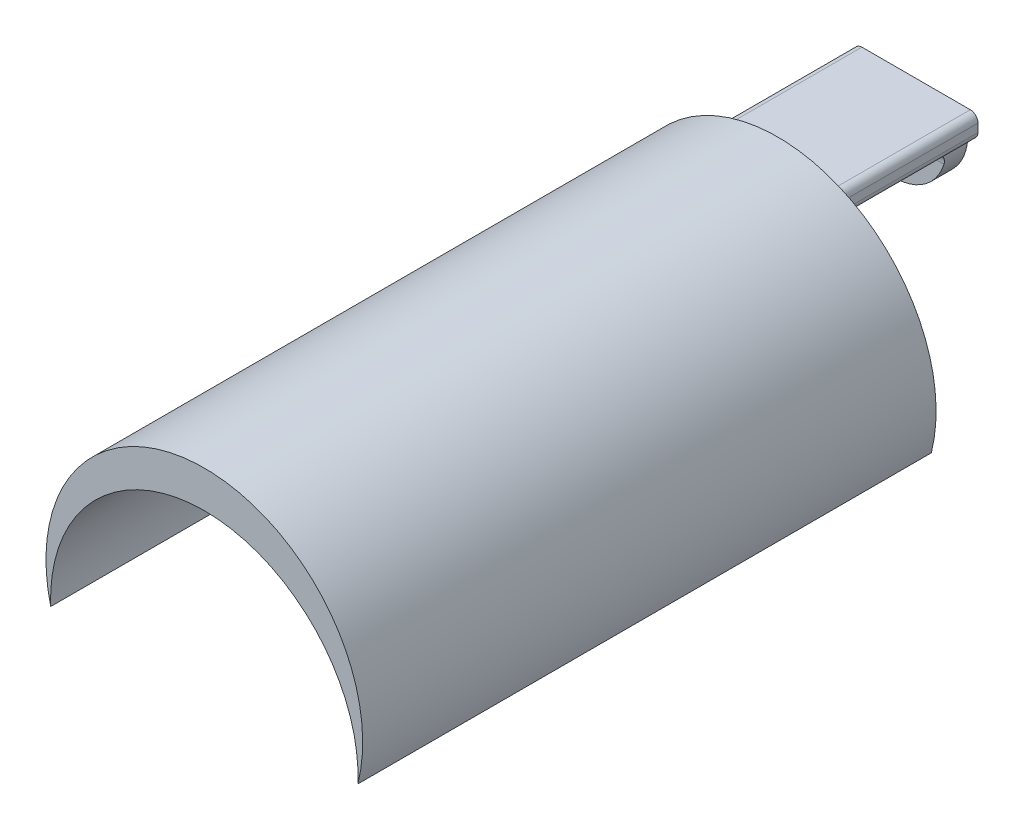
ISO-10303-21;
HEADER;
FILE_DESCRIPTION(('STEP AP214'),'2;1');
FILE_NAME('part.step','',(''),(''),'','','');
FILE_SCHEMA(('AUTOMOTIVE_DESIGN { 1 0 10303 214 1 1 1 1 }'));
ENDSEC;
DATA;
#1=APPLICATION_CONTEXT('core data for automotive mechanical design processes');
#2=APPLICATION_PROTOCOL_DEFINITION('international standard','automotive_design',2000,#1);
#3=PRODUCT_CONTEXT('',#1,'mechanical');
#4=PRODUCT('Part','Part','',(#3));
#5=PRODUCT_RELATED_PRODUCT_CATEGORY('part','',(#4));
#6=PRODUCT_DEFINITION_FORMATION('','',#4);
#7=PRODUCT_DEFINITION_CONTEXT('part definition',#1,'design');
#8=PRODUCT_DEFINITION('design','',#6,#7);
#9=PRODUCT_DEFINITION_SHAPE('','',#8);
#10=(LENGTH_UNIT() NAMED_UNIT(*) SI_UNIT(.MILLI.,.METRE.));
#11=(NAMED_UNIT(*) PLANE_ANGLE_UNIT() SI_UNIT($,.RADIAN.));
#12=(NAMED_UNIT(*) SI_UNIT($,.STERADIAN.) SOLID_ANGLE_UNIT());
#13=UNCERTAINTY_MEASURE_WITH_UNIT(LENGTH_MEASURE(1.E-05),#10,'distance_accuracy_value','');
#14=(GEOMETRIC_REPRESENTATION_CONTEXT(3) GLOBAL_UNCERTAINTY_ASSIGNED_CONTEXT((#13)) GLOBAL_UNIT_ASSIGNED_CONTEXT((#10,
#11,#12)) REPRESENTATION_CONTEXT('',''));
#15=CARTESIAN_POINT('',(0.,0.,0.));
#16=DIRECTION('',(0.,0.,1.));
#17=DIRECTION('',(1.,0.,0.));
#18=AXIS2_PLACEMENT_3D('',#15,#16,#17);
#19=CARTESIAN_POINT('',(0.,0.,0.));
#20=DIRECTION('',(0.,0.,1.));
#21=DIRECTION('',(1.,0.,0.));
#22=AXIS2_PLACEMENT_3D('',#19,#20,#21);
#23=PLANE('',#22);
#24=CARTESIAN_POINT('',(0.,0.,0.));
#25=DIRECTION('',(0.,0.,1.));
#26=DIRECTION('',(1.,0.,0.));
#27=AXIS2_PLACEMENT_3D('',#24,#25,#26);
#28=CIRCLE('',#27,26.162);
#29=CARTESIAN_POINT('',(25.3796718654911,-6.34999999999999,0.));
#30=VERTEX_POINT('',#29);
#31=CARTESIAN_POINT('',(-25.3796718654911,-6.34999999999999,0.));
#32=VERTEX_POINT('',#31);
#33=EDGE_CURVE('E219',#30,#32,#28,.T.);
#34=ORIENTED_EDGE('',*,*,#33,.F.);
#35=DIRECTION('',(-1.,0.,0.));
#36=VECTOR('',#35,1.);
#37=CARTESIAN_POINT('',(0.,-6.34999999999999,0.));
#38=LINE('',#37,#36);
#39=CARTESIAN_POINT('',(19.8388283648417,-6.34999999999999,0.));
#40=VERTEX_POINT('',#39);
#41=EDGE_CURVE('E194',#30,#40,#38,.T.);
#42=ORIENTED_EDGE('',*,*,#41,.T.);
#43=CARTESIAN_POINT('',(0.,-3.33914545181102,0.));
#44=DIRECTION('',(0.,0.,1.));
#45=DIRECTION('',(1.,0.,0.));
#46=AXIS2_PLACEMENT_3D('',#43,#44,#45);
#47=CIRCLE('',#46,20.066);
#48=CARTESIAN_POINT('',(-19.8388283648418,-6.35,0.));
#49=VERTEX_POINT('',#48);
#50=EDGE_CURVE('E207',#40,#49,#47,.T.);
#51=ORIENTED_EDGE('',*,*,#50,.T.);
#52=EDGE_CURVE('E198',#49,#32,#38,.T.);
#53=ORIENTED_EDGE('',*,*,#52,.T.);
#54=EDGE_LOOP('',(#34,#42,#51,#53));
#55=FACE_BOUND('',#54,.T.);
#56=CARTESIAN_POINT('',(-8.95790759547679,21.8350726392476,0.));
#57=DIRECTION('',(0.,0.,-1.));
#58=DIRECTION('',(-1.,0.,0.));
#59=AXIS2_PLACEMENT_3D('',#56,#57,#58);
#60=CIRCLE('',#59,1.27);
#61=CARTESIAN_POINT('',(-10.2279075954768,21.8350726392475,0.));
#62=VERTEX_POINT('',#61);
#63=CARTESIAN_POINT('',(-8.95790759547678,23.1050726392476,0.));
#64=VERTEX_POINT('',#63);
#65=EDGE_CURVE('E184',#62,#64,#60,.T.);
#66=ORIENTED_EDGE('',*,*,#65,.F.);
#67=DIRECTION('',(0.,1.,0.));
#68=VECTOR('',#67,1.);
#69=CARTESIAN_POINT('',(-10.2279075954768,21.8350726392475,0.));
#70=LINE('',#69,#68);
#71=CARTESIAN_POINT('',(-10.2279075954768,20.4735079918104,0.));
#72=VERTEX_POINT('',#71);
#73=EDGE_CURVE('E181',#72,#62,#70,.T.);
#74=ORIENTED_EDGE('',*,*,#73,.F.);
#75=CARTESIAN_POINT('',(-8.95790759547679,20.4735079918104,0.));
#76=DIRECTION('',(0.,0.,-1.));
#77=DIRECTION('',(1.,0.,0.));
#78=AXIS2_PLACEMENT_3D('',#75,#76,#77);
#79=CIRCLE('',#78,1.27);
#80=CARTESIAN_POINT('',(-8.95790759547678,19.2035079918104,0.));
#81=VERTEX_POINT('',#80);
#82=EDGE_CURVE('E335',#81,#72,#79,.T.);
#83=ORIENTED_EDGE('',*,*,#82,.F.);
#84=DIRECTION('',(-1.,0.,0.));
#85=VECTOR('',#84,1.);
#86=CARTESIAN_POINT('',(8.95790759547678,19.2035079918104,0.));
#87=LINE('',#86,#85);
#88=CARTESIAN_POINT('',(8.95790759547678,19.2035079918104,0.));
#89=VERTEX_POINT('',#88);
#90=EDGE_CURVE('E367',#89,#81,#87,.T.);
#91=ORIENTED_EDGE('',*,*,#90,.F.);
#92=CARTESIAN_POINT('',(8.95790759547679,20.4735079918104,0.));
#93=DIRECTION('',(0.,0.,-1.));
#94=DIRECTION('',(-1.,0.,0.));
#95=AXIS2_PLACEMENT_3D('',#92,#93,#94);
#96=CIRCLE('',#95,1.27);
#97=CARTESIAN_POINT('',(10.2279075954768,20.4735079918104,0.));
#98=VERTEX_POINT('',#97);
#99=EDGE_CURVE('E361',#98,#89,#96,.T.);
#100=ORIENTED_EDGE('',*,*,#99,.F.);
#101=DIRECTION('',(0.,-1.,0.));
#102=VECTOR('',#101,1.);
#103=CARTESIAN_POINT('',(10.2279075954768,21.8350726392475,0.));
#104=LINE('',#103,#102);
#105=CARTESIAN_POINT('',(10.2279075954768,21.8350726392475,0.));
#106=VERTEX_POINT('',#105);
#107=EDGE_CURVE('E356',#106,#98,#104,.T.);
#108=ORIENTED_EDGE('',*,*,#107,.F.);
#109=CARTESIAN_POINT('',(8.95790759547679,21.8350726392476,0.));
#110=DIRECTION('',(0.,0.,-1.));
#111=DIRECTION('',(1.,0.,0.));
#112=AXIS2_PLACEMENT_3D('',#109,#110,#111);
#113=CIRCLE('',#112,1.27);
#114=CARTESIAN_POINT('',(8.95790759547678,23.1050726392476,0.));
#115=VERTEX_POINT('',#114);
#116=EDGE_CURVE('E359',#115,#106,#113,.T.);
#117=ORIENTED_EDGE('',*,*,#116,.F.);
#118=DIRECTION('',(1.,0.,0.));
#119=VECTOR('',#118,1.);
#120=CARTESIAN_POINT('',(8.95790759547678,23.1050726392476,0.));
#121=LINE('',#120,#119);
#122=EDGE_CURVE('E328',#64,#115,#121,.T.);
#123=ORIENTED_EDGE('',*,*,#122,.F.);
#124=EDGE_LOOP('',(#66,#74,#83,#91,#100,#108,#117,#123));
#125=FACE_BOUND('',#124,.T.);
#126=ADVANCED_FACE('F33',(#55,#125),#23,.F.);
#127=CARTESIAN_POINT('',(0.,0.,94.742));
#128=DIRECTION('',(0.,0.,-1.));
#129=DIRECTION('',(-1.,0.,0.));
#130=AXIS2_PLACEMENT_3D('',#127,#128,#129);
#131=CYLINDRICAL_SURFACE('',#130,26.162);
#132=DIRECTION('',(0.,0.,1.));
#133=VECTOR('',#132,1.);
#134=CARTESIAN_POINT('',(25.3796718654911,-6.34999999999999,77.216));
#135=LINE('',#134,#133);
#136=CARTESIAN_POINT('',(25.3796718654911,-6.34999999999999,94.742));
#137=VERTEX_POINT('',#136);
#138=CARTESIAN_POINT('',(25.3796718654911,-6.34999999999999,59.69));
#139=VERTEX_POINT('',#138);
#140=EDGE_CURVE('E213',#137,#139,#135,.F.);
#141=ORIENTED_EDGE('',*,*,#140,.T.);
#142=DIRECTION('',(0.,0.,-1.));
#143=VECTOR('',#142,1.);
#144=CARTESIAN_POINT('',(25.3796718654911,-6.34999999999999,94.742));
#145=LINE('',#144,#143);
#146=EDGE_CURVE('E197',#139,#30,#145,.T.);
#147=ORIENTED_EDGE('',*,*,#146,.T.);
#148=ORIENTED_EDGE('',*,*,#33,.T.);
#149=DIRECTION('',(0.,0.,-1.));
#150=VECTOR('',#149,1.);
#151=CARTESIAN_POINT('',(-25.3796718654911,-6.34999999999999,94.742));
#152=LINE('',#151,#150);
#153=CARTESIAN_POINT('',(-25.3796718654911,-6.34999999999999,59.69));
#154=VERTEX_POINT('',#153);
#155=EDGE_CURVE('E201',#32,#154,#152,.F.);
#156=ORIENTED_EDGE('',*,*,#155,.T.);
#157=DIRECTION('',(0.,0.,1.));
#158=VECTOR('',#157,1.);
#159=CARTESIAN_POINT('',(-25.3796718654911,-6.34999999999999,77.216));
#160=LINE('',#159,#158);
#161=CARTESIAN_POINT('',(-25.3796718654911,-6.34999999999999,94.742));
#162=VERTEX_POINT('',#161);
#163=EDGE_CURVE('E216',#154,#162,#160,.T.);
#164=ORIENTED_EDGE('',*,*,#163,.T.);
#165=CARTESIAN_POINT('',(0.,0.,94.742));
#166=DIRECTION('',(0.,0.,1.));
#167=DIRECTION('',(1.,0.,0.));
#168=AXIS2_PLACEMENT_3D('',#165,#166,#167);
#169=CIRCLE('',#168,26.162);
#170=EDGE_CURVE('E220',#137,#162,#169,.T.);
#171=ORIENTED_EDGE('',*,*,#170,.F.);
#172=EDGE_LOOP('',(#141,#147,#148,#156,#164,#171));
#173=FACE_BOUND('',#172,.T.);
#174=ADVANCED_FACE('F307',(#173),#131,.T.);
#175=CARTESIAN_POINT('',(0.,0.,94.742));
#176=DIRECTION('',(0.,0.,1.));
#177=DIRECTION('',(1.,0.,0.));
#178=AXIS2_PLACEMENT_3D('',#175,#176,#177);
#179=PLANE('',#178);
#180=CARTESIAN_POINT('',(0.,-5.334,94.742));
#181=DIRECTION('',(0.,0.,1.));
#182=DIRECTION('',(1.,0.,0.));
#183=AXIS2_PLACEMENT_3D('',#180,#181,#182);
#184=CIRCLE('',#183,25.4);
#185=EDGE_CURVE('E223',#137,#162,#184,.T.);
#186=ORIENTED_EDGE('',*,*,#185,.F.);
#187=ORIENTED_EDGE('',*,*,#170,.T.);
#188=EDGE_LOOP('',(#186,#187));
#189=FACE_BOUND('',#188,.T.);
#190=ADVANCED_FACE('F300',(#189),#179,.T.);
#191=CARTESIAN_POINT('',(0.,-5.334,59.69));
#192=DIRECTION('',(0.,0.,1.));
#193=DIRECTION('',(1.,0.,0.));
#194=AXIS2_PLACEMENT_3D('',#191,#192,#193);
#195=PLANE('',#194);
#196=DIRECTION('',(1.,0.,0.));
#197=VECTOR('',#196,1.);
#198=CARTESIAN_POINT('',(-33.909,-6.34999999999999,59.69));
#199=LINE('',#198,#197);
#200=CARTESIAN_POINT('',(19.8388283648418,-6.35,59.69));
#201=VERTEX_POINT('',#200);
#202=EDGE_CURVE('E185',#201,#139,#199,.T.);
#203=ORIENTED_EDGE('',*,*,#202,.T.);
#204=CARTESIAN_POINT('',(0.,-5.334,59.69));
#205=DIRECTION('',(0.,0.,1.));
#206=DIRECTION('',(1.,0.,0.));
#207=AXIS2_PLACEMENT_3D('',#204,#205,#206);
#208=CIRCLE('',#207,25.4);
#209=EDGE_CURVE('E210',#139,#154,#208,.T.);
#210=ORIENTED_EDGE('',*,*,#209,.T.);
#211=CARTESIAN_POINT('',(-19.8388283648417,-6.34999999999999,59.69));
#212=VERTEX_POINT('',#211);
#213=EDGE_CURVE('E188',#154,#212,#199,.T.);
#214=ORIENTED_EDGE('',*,*,#213,.T.);
#215=CARTESIAN_POINT('',(0.,-3.33914545181102,59.69));
#216=DIRECTION('',(0.,0.,1.));
#217=DIRECTION('',(1.,0.,0.));
#218=AXIS2_PLACEMENT_3D('',#215,#216,#217);
#219=CIRCLE('',#218,20.066);
#220=EDGE_CURVE('E204',#201,#212,#219,.T.);
#221=ORIENTED_EDGE('',*,*,#220,.F.);
#222=EDGE_LOOP('',(#203,#210,#214,#221));
#223=FACE_BOUND('',#222,.T.);
#224=ADVANCED_FACE('F297',(#223),#195,.T.);
#225=CARTESIAN_POINT('',(0.,-5.334,59.69));
#226=DIRECTION('',(0.,0.,1.));
#227=DIRECTION('',(1.,0.,0.));
#228=AXIS2_PLACEMENT_3D('',#225,#226,#227);
#229=CYLINDRICAL_SURFACE('',#228,25.4);
#230=ORIENTED_EDGE('',*,*,#209,.F.);
#231=ORIENTED_EDGE('',*,*,#140,.F.);
#232=ORIENTED_EDGE('',*,*,#185,.T.);
#233=ORIENTED_EDGE('',*,*,#163,.F.);
#234=EDGE_LOOP('',(#230,#231,#232,#233));
#235=FACE_BOUND('',#234,.T.);
#236=ADVANCED_FACE('F295',(#235),#229,.F.);
#237=CARTESIAN_POINT('',(0.,-3.33914545181102,-74.93));
#238=DIRECTION('',(0.,0.,1.));
#239=DIRECTION('',(1.,0.,0.));
#240=AXIS2_PLACEMENT_3D('',#237,#238,#239);
#241=CYLINDRICAL_SURFACE('',#240,20.066);
#242=ORIENTED_EDGE('',*,*,#220,.T.);
#243=DIRECTION('',(0.,0.,1.));
#244=VECTOR('',#243,1.);
#245=CARTESIAN_POINT('',(-19.8388283648417,-6.34999999999999,-74.93));
#246=LINE('',#245,#244);
#247=EDGE_CURVE('E230',#212,#49,#246,.F.);
#248=ORIENTED_EDGE('',*,*,#247,.T.);
#249=ORIENTED_EDGE('',*,*,#50,.F.);
#250=DIRECTION('',(0.,0.,1.));
#251=VECTOR('',#250,1.);
#252=CARTESIAN_POINT('',(19.8388283648417,-6.34999999999999,-74.93));
#253=LINE('',#252,#251);
#254=EDGE_CURVE('E227',#40,#201,#253,.T.);
#255=ORIENTED_EDGE('',*,*,#254,.T.);
#256=EDGE_LOOP('',(#242,#248,#249,#255));
#257=FACE_BOUND('',#256,.T.);
#258=ADVANCED_FACE('F292',(#257),#241,.F.);
#259=CARTESIAN_POINT('',(-33.909,-6.34999999999999,59.69));
#260=DIRECTION('',(0.,1.,0.));
#261=DIRECTION('',(0.,0.,1.));
#262=AXIS2_PLACEMENT_3D('',#259,#260,#261);
#263=PLANE('',#262);
#264=ORIENTED_EDGE('',*,*,#202,.F.);
#265=ORIENTED_EDGE('',*,*,#254,.F.);
#266=ORIENTED_EDGE('',*,*,#41,.F.);
#267=ORIENTED_EDGE('',*,*,#146,.F.);
#268=EDGE_LOOP('',(#264,#265,#266,#267));
#269=FACE_BOUND('',#268,.T.);
#270=ADVANCED_FACE('F290',(#269),#263,.F.);
#271=ORIENTED_EDGE('',*,*,#52,.F.);
#272=ORIENTED_EDGE('',*,*,#247,.F.);
#273=ORIENTED_EDGE('',*,*,#213,.F.);
#274=ORIENTED_EDGE('',*,*,#155,.F.);
#275=EDGE_LOOP('',(#271,#272,#273,#274));
#276=FACE_BOUND('',#275,.T.);
#277=ADVANCED_FACE('F287',(#276),#263,.F.);
#278=CARTESIAN_POINT('',(-8.95790759547679,21.8350726392476,-22.86));
#279=DIRECTION('',(0.,0.,1.));
#280=DIRECTION('',(1.,0.,0.));
#281=AXIS2_PLACEMENT_3D('',#278,#279,#280);
#282=CYLINDRICAL_SURFACE('',#281,1.27);
#283=ORIENTED_EDGE('',*,*,#65,.T.);
#284=DIRECTION('',(0.,0.,1.));
#285=VECTOR('',#284,1.);
#286=CARTESIAN_POINT('',(-8.95790759547678,23.1050726392476,-22.86));
#287=LINE('',#286,#285);
#288=CARTESIAN_POINT('',(-8.95790759547678,23.1050726392476,-22.86));
#289=VERTEX_POINT('',#288);
#290=EDGE_CURVE('E165',#289,#64,#287,.T.);
#291=ORIENTED_EDGE('',*,*,#290,.F.);
#292=CARTESIAN_POINT('',(-8.95790759547679,21.8350726392476,-22.86));
#293=DIRECTION('',(0.,0.,-1.));
#294=DIRECTION('',(-1.,0.,0.));
#295=AXIS2_PLACEMENT_3D('',#292,#293,#294);
#296=CIRCLE('',#295,1.27);
#297=CARTESIAN_POINT('',(-10.2279075954768,21.8350726392475,-22.86));
#298=VERTEX_POINT('',#297);
#299=EDGE_CURVE('E172',#298,#289,#296,.T.);
#300=ORIENTED_EDGE('',*,*,#299,.F.);
#301=DIRECTION('',(0.,0.,1.));
#302=VECTOR('',#301,1.);
#303=CARTESIAN_POINT('',(-10.2279075954768,21.8350726392475,-22.86));
#304=LINE('',#303,#302);
#305=EDGE_CURVE('E332',#298,#62,#304,.T.);
#306=ORIENTED_EDGE('',*,*,#305,.T.);
#307=EDGE_LOOP('',(#283,#291,#300,#306));
#308=FACE_BOUND('',#307,.T.);
#309=ADVANCED_FACE('F183',(#308),#282,.T.);
#310=CARTESIAN_POINT('',(8.95790759547678,23.1050726392476,-22.86));
#311=DIRECTION('',(0.,-1.,0.));
#312=DIRECTION('',(0.,0.,-1.));
#313=AXIS2_PLACEMENT_3D('',#310,#311,#312);
#314=PLANE('',#313);
#315=ORIENTED_EDGE('',*,*,#122,.T.);
#316=DIRECTION('',(0.,0.,1.));
#317=VECTOR('',#316,1.);
#318=CARTESIAN_POINT('',(8.95790759547678,23.1050726392476,-22.86));
#319=LINE('',#318,#317);
#320=CARTESIAN_POINT('',(8.95790759547678,23.1050726392476,-22.86));
#321=VERTEX_POINT('',#320);
#322=EDGE_CURVE('E168',#321,#115,#319,.T.);
#323=ORIENTED_EDGE('',*,*,#322,.F.);
#324=DIRECTION('',(1.,0.,0.));
#325=VECTOR('',#324,1.);
#326=CARTESIAN_POINT('',(8.95790759547678,23.1050726392476,-22.86));
#327=LINE('',#326,#325);
#328=EDGE_CURVE('E160',#289,#321,#327,.T.);
#329=ORIENTED_EDGE('',*,*,#328,.F.);
#330=ORIENTED_EDGE('',*,*,#290,.T.);
#331=EDGE_LOOP('',(#315,#323,#329,#330));
#332=FACE_BOUND('',#331,.T.);
#333=ADVANCED_FACE('F163',(#332),#314,.F.);
#334=CARTESIAN_POINT('',(8.95790759547679,21.8350726392476,-22.86));
#335=DIRECTION('',(0.,0.,1.));
#336=DIRECTION('',(1.,0.,0.));
#337=AXIS2_PLACEMENT_3D('',#334,#335,#336);
#338=CYLINDRICAL_SURFACE('',#337,1.27);
#339=ORIENTED_EDGE('',*,*,#116,.T.);
#340=DIRECTION('',(0.,0.,1.));
#341=VECTOR('',#340,1.);
#342=CARTESIAN_POINT('',(10.2279075954768,21.8350726392475,-22.86));
#343=LINE('',#342,#341);
#344=CARTESIAN_POINT('',(10.2279075954768,21.8350726392475,-22.86));
#345=VERTEX_POINT('',#344);
#346=EDGE_CURVE('E190',#345,#106,#343,.T.);
#347=ORIENTED_EDGE('',*,*,#346,.F.);
#348=CARTESIAN_POINT('',(8.95790759547679,21.8350726392476,-22.86));
#349=DIRECTION('',(0.,0.,-1.));
#350=DIRECTION('',(1.,0.,0.));
#351=AXIS2_PLACEMENT_3D('',#348,#349,#350);
#352=CIRCLE('',#351,1.27);
#353=EDGE_CURVE('E171',#321,#345,#352,.T.);
#354=ORIENTED_EDGE('',*,*,#353,.F.);
#355=ORIENTED_EDGE('',*,*,#322,.T.);
#356=EDGE_LOOP('',(#339,#347,#354,#355));
#357=FACE_BOUND('',#356,.T.);
#358=ADVANCED_FACE('F278',(#357),#338,.T.);
#359=CARTESIAN_POINT('',(10.2279075954768,21.8350726392475,-22.86));
#360=DIRECTION('',(-1.,0.,0.));
#361=DIRECTION('',(0.,0.,1.));
#362=AXIS2_PLACEMENT_3D('',#359,#360,#361);
#363=PLANE('',#362);
#364=ORIENTED_EDGE('',*,*,#107,.T.);
#365=DIRECTION('',(0.,0.,1.));
#366=VECTOR('',#365,1.);
#367=CARTESIAN_POINT('',(10.2279075954768,20.4735079918104,-22.86));
#368=LINE('',#367,#366);
#369=CARTESIAN_POINT('',(10.2279075954768,20.4735079918104,-22.86));
#370=VERTEX_POINT('',#369);
#371=EDGE_CURVE('E349',#370,#98,#368,.T.);
#372=ORIENTED_EDGE('',*,*,#371,.F.);
#373=DIRECTION('',(0.,-1.,0.));
#374=VECTOR('',#373,1.);
#375=CARTESIAN_POINT('',(10.2279075954768,21.8350726392475,-22.86));
#376=LINE('',#375,#374);
#377=EDGE_CURVE('E357',#345,#370,#376,.T.);
#378=ORIENTED_EDGE('',*,*,#377,.F.);
#379=ORIENTED_EDGE('',*,*,#346,.T.);
#380=EDGE_LOOP('',(#364,#372,#378,#379));
#381=FACE_BOUND('',#380,.T.);
#382=ADVANCED_FACE('F274',(#381),#363,.F.);
#383=CARTESIAN_POINT('',(8.95790759547679,20.4735079918104,-22.86));
#384=DIRECTION('',(0.,0.,1.));
#385=DIRECTION('',(1.,0.,0.));
#386=AXIS2_PLACEMENT_3D('',#383,#384,#385);
#387=CYLINDRICAL_SURFACE('',#386,1.27);
#388=ORIENTED_EDGE('',*,*,#99,.T.);
#389=DIRECTION('',(0.,0.,1.));
#390=VECTOR('',#389,1.);
#391=CARTESIAN_POINT('',(8.95790759547678,19.2035079918104,-22.86));
#392=LINE('',#391,#390);
#393=CARTESIAN_POINT('',(8.95790759547678,19.2035079918104,-22.86));
#394=VERTEX_POINT('',#393);
#395=EDGE_CURVE('E346',#394,#89,#392,.T.);
#396=ORIENTED_EDGE('',*,*,#395,.F.);
#397=CARTESIAN_POINT('',(8.95790759547679,20.4735079918104,-22.86));
#398=DIRECTION('',(0.,0.,-1.));
#399=DIRECTION('',(-1.,0.,0.));
#400=AXIS2_PLACEMENT_3D('',#397,#398,#399);
#401=CIRCLE('',#400,1.27);
#402=EDGE_CURVE('E377',#370,#394,#401,.T.);
#403=ORIENTED_EDGE('',*,*,#402,.F.);
#404=ORIENTED_EDGE('',*,*,#371,.T.);
#405=EDGE_LOOP('',(#388,#396,#403,#404));
#406=FACE_BOUND('',#405,.T.);
#407=ADVANCED_FACE('F271',(#406),#387,.T.);
#408=CARTESIAN_POINT('',(8.95790759547678,19.2035079918104,-22.86));
#409=DIRECTION('',(0.,1.,0.));
#410=DIRECTION('',(0.,0.,1.));
#411=AXIS2_PLACEMENT_3D('',#408,#409,#410);
#412=PLANE('',#411);
#413=DIRECTION('',(-1.,0.,0.));
#414=VECTOR('',#413,1.);
#415=CARTESIAN_POINT('',(8.95790759547678,19.2035079918104,-22.86));
#416=LINE('',#415,#414);
#417=CARTESIAN_POINT('',(-8.78994828741212,19.2035079918104,-22.86));
#418=VERTEX_POINT('',#417);
#419=CARTESIAN_POINT('',(-8.95790759547678,19.2035079918104,-22.86));
#420=VERTEX_POINT('',#419);
#421=EDGE_CURVE('E378',#418,#420,#416,.T.);
#422=ORIENTED_EDGE('',*,*,#421,.F.);
#423=DIRECTION('',(0.,0.,-1.));
#424=VECTOR('',#423,1.);
#425=CARTESIAN_POINT('',(-8.78994828741212,19.2035079918104,-22.86));
#426=LINE('',#425,#424);
#427=CARTESIAN_POINT('',(-8.78994828741212,19.2035079918104,-16.764));
#428=VERTEX_POINT('',#427);
#429=EDGE_CURVE('E387',#418,#428,#426,.F.);
#430=ORIENTED_EDGE('',*,*,#429,.T.);
#431=DIRECTION('',(1.,0.,0.));
#432=VECTOR('',#431,1.);
#433=CARTESIAN_POINT('',(8.53961739532595,19.2035079918104,-16.764));
#434=LINE('',#433,#432);
#435=CARTESIAN_POINT('',(8.78994828741212,19.2035079918104,-16.764));
#436=VERTEX_POINT('',#435);
#437=EDGE_CURVE('E52',#428,#436,#434,.T.);
#438=ORIENTED_EDGE('',*,*,#437,.T.);
#439=DIRECTION('',(0.,0.,-1.));
#440=VECTOR('',#439,1.);
#441=CARTESIAN_POINT('',(8.78994828741212,19.2035079918104,-22.86));
#442=LINE('',#441,#440);
#443=CARTESIAN_POINT('',(8.78994828741212,19.2035079918104,-22.86));
#444=VERTEX_POINT('',#443);
#445=EDGE_CURVE('E394',#436,#444,#442,.T.);
#446=ORIENTED_EDGE('',*,*,#445,.T.);
#447=EDGE_CURVE('E375',#394,#444,#416,.T.);
#448=ORIENTED_EDGE('',*,*,#447,.F.);
#449=ORIENTED_EDGE('',*,*,#395,.T.);
#450=ORIENTED_EDGE('',*,*,#90,.T.);
#451=DIRECTION('',(0.,0.,1.));
#452=VECTOR('',#451,1.);
#453=CARTESIAN_POINT('',(-8.95790759547678,19.2035079918104,-22.86));
#454=LINE('',#453,#452);
#455=EDGE_CURVE('E338',#420,#81,#454,.T.);
#456=ORIENTED_EDGE('',*,*,#455,.F.);
#457=EDGE_LOOP('',(#422,#430,#438,#446,#448,#449,#450,#456));
#458=FACE_BOUND('',#457,.T.);
#459=ADVANCED_FACE('F267',(#458),#412,.F.);
#460=CARTESIAN_POINT('',(-8.95790759547679,20.4735079918104,-22.86));
#461=DIRECTION('',(0.,0.,1.));
#462=DIRECTION('',(1.,0.,0.));
#463=AXIS2_PLACEMENT_3D('',#460,#461,#462);
#464=CYLINDRICAL_SURFACE('',#463,1.27);
#465=ORIENTED_EDGE('',*,*,#82,.T.);
#466=DIRECTION('',(0.,0.,1.));
#467=VECTOR('',#466,1.);
#468=CARTESIAN_POINT('',(-10.2279075954768,20.4735079918104,-22.86));
#469=LINE('',#468,#467);
#470=CARTESIAN_POINT('',(-10.2279075954768,20.4735079918104,-22.86));
#471=VERTEX_POINT('',#470);
#472=EDGE_CURVE('E334',#471,#72,#469,.T.);
#473=ORIENTED_EDGE('',*,*,#472,.F.);
#474=CARTESIAN_POINT('',(-8.95790759547679,20.4735079918104,-22.86));
#475=DIRECTION('',(0.,0.,-1.));
#476=DIRECTION('',(1.,0.,0.));
#477=AXIS2_PLACEMENT_3D('',#474,#475,#476);
#478=CIRCLE('',#477,1.27);
#479=EDGE_CURVE('E340',#420,#471,#478,.T.);
#480=ORIENTED_EDGE('',*,*,#479,.F.);
#481=ORIENTED_EDGE('',*,*,#455,.T.);
#482=EDGE_LOOP('',(#465,#473,#480,#481));
#483=FACE_BOUND('',#482,.T.);
#484=ADVANCED_FACE('F263',(#483),#464,.T.);
#485=CARTESIAN_POINT('',(-10.2279075954768,21.8350726392475,-22.86));
#486=DIRECTION('',(1.,0.,0.));
#487=DIRECTION('',(0.,0.,-1.));
#488=AXIS2_PLACEMENT_3D('',#485,#486,#487);
#489=PLANE('',#488);
#490=ORIENTED_EDGE('',*,*,#73,.T.);
#491=ORIENTED_EDGE('',*,*,#305,.F.);
#492=DIRECTION('',(0.,1.,0.));
#493=VECTOR('',#492,1.);
#494=CARTESIAN_POINT('',(-10.2279075954768,21.8350726392475,-22.86));
#495=LINE('',#494,#493);
#496=EDGE_CURVE('E177',#471,#298,#495,.T.);
#497=ORIENTED_EDGE('',*,*,#496,.F.);
#498=ORIENTED_EDGE('',*,*,#472,.T.);
#499=EDGE_LOOP('',(#490,#491,#497,#498));
#500=FACE_BOUND('',#499,.T.);
#501=ADVANCED_FACE('F260',(#500),#489,.F.);
#502=CARTESIAN_POINT('',(-8.95790759547679,21.8350726392476,-22.86));
#503=DIRECTION('',(0.,0.,-1.));
#504=DIRECTION('',(-1.,0.,0.));
#505=AXIS2_PLACEMENT_3D('',#502,#503,#504);
#506=PLANE('',#505);
#507=ORIENTED_EDGE('',*,*,#299,.T.);
#508=ORIENTED_EDGE('',*,*,#328,.T.);
#509=ORIENTED_EDGE('',*,*,#353,.T.);
#510=ORIENTED_EDGE('',*,*,#377,.T.);
#511=ORIENTED_EDGE('',*,*,#402,.T.);
#512=ORIENTED_EDGE('',*,*,#447,.T.);
#513=CARTESIAN_POINT('',(8.78994828741212,18.9495079918104,-22.86));
#514=DIRECTION('',(0.,0.,-1.));
#515=DIRECTION('',(-1.,0.,0.));
#516=AXIS2_PLACEMENT_3D('',#513,#514,#515);
#517=CIRCLE('',#516,0.254);
#518=CARTESIAN_POINT('',(8.53605426807607,18.9568446767149,-22.86));
#519=VERTEX_POINT('',#518);
#520=EDGE_CURVE('E46',#444,#519,#517,.F.);
#521=ORIENTED_EDGE('',*,*,#520,.T.);
#522=CARTESIAN_POINT('',(0.,19.2035079918104,-22.86));
#523=DIRECTION('',(0.,0.,-1.));
#524=DIRECTION('',(-1.,0.,0.));
#525=AXIS2_PLACEMENT_3D('',#522,#523,#524);
#526=CIRCLE('',#525,8.53961739532595);
#527=CARTESIAN_POINT('',(-8.53605426807607,18.9568446767149,-22.86));
#528=VERTEX_POINT('',#527);
#529=EDGE_CURVE('E423',#519,#528,#526,.T.);
#530=ORIENTED_EDGE('',*,*,#529,.T.);
#531=CARTESIAN_POINT('',(-8.78994828741212,18.9495079918104,-22.86));
#532=DIRECTION('',(0.,0.,-1.));
#533=DIRECTION('',(-1.,0.,0.));
#534=AXIS2_PLACEMENT_3D('',#531,#532,#533);
#535=CIRCLE('',#534,0.254);
#536=EDGE_CURVE('E385',#528,#418,#535,.F.);
#537=ORIENTED_EDGE('',*,*,#536,.T.);
#538=ORIENTED_EDGE('',*,*,#421,.T.);
#539=ORIENTED_EDGE('',*,*,#479,.T.);
#540=ORIENTED_EDGE('',*,*,#496,.T.);
#541=EDGE_LOOP('',(#507,#508,#509,#510,#511,#512,#521,#530,#537,#538,#539,#540));
#542=FACE_BOUND('',#541,.T.);
#543=ADVANCED_FACE('F175',(#542),#506,.T.);
#544=CARTESIAN_POINT('',(0.,19.2035079918104,-19.304));
#545=DIRECTION('',(0.,0.,-1.));
#546=DIRECTION('',(-1.,0.,0.));
#547=AXIS2_PLACEMENT_3D('',#544,#545,#546);
#548=CYLINDRICAL_SURFACE('',#547,8.53961739532595);
#549=CARTESIAN_POINT('',(-8.15312610343748,16.6635079918104,-19.304));
#550=CARTESIAN_POINT('',(-8.17429483655162,16.731430897513,-19.3040072272775));
#551=CARTESIAN_POINT('',(-8.19460173279454,16.7996289703768,-19.3012752423334));
#552=CARTESIAN_POINT('',(-8.23340486100657,16.9361066349082,-19.2902559630849));
#553=CARTESIAN_POINT('',(-8.25190068693678,17.0043862413983,-19.2819674262643));
#554=CARTESIAN_POINT('',(-8.28698368359402,17.1405217178281,-19.2597590038914));
#555=CARTESIAN_POINT('',(-8.30357101176611,17.2083776222845,-19.2458395832977));
#556=CARTESIAN_POINT('',(-8.33479504841148,17.3431181785758,-19.2123783810174));
#557=CARTESIAN_POINT('',(-8.34943194899448,17.4100029254869,-19.1928371536574));
#558=CARTESIAN_POINT('',(-8.39045646875993,17.6086660784005,-19.1257324843628));
#559=CARTESIAN_POINT('',(-8.41392344666187,17.7383179155924,-19.0697098449856));
#560=CARTESIAN_POINT('',(-8.45349871043653,17.9872188621018,-18.9364033705861));
#561=CARTESIAN_POINT('',(-8.4696116801242,18.1064745535205,-18.8591331187067));
#562=CARTESIAN_POINT('',(-8.49536973162951,18.3283161658075,-18.6873425298294));
#563=CARTESIAN_POINT('',(-8.50515172772302,18.4312158852261,-18.5932477928077));
#564=CARTESIAN_POINT('',(-8.52021680317795,18.620408108801,-18.3892702885741));
#565=CARTESIAN_POINT('',(-8.52549824637782,18.7066945644418,-18.2793817965459));
#566=CARTESIAN_POINT('',(-8.53309176115469,18.8608163049181,-18.0458676980219));
#567=CARTESIAN_POINT('',(-8.5353771411993,18.9284815456502,-17.9221291288946));
#568=CARTESIAN_POINT('',(-8.53828868792137,19.0424195659689,-17.6651743765171));
#569=CARTESIAN_POINT('',(-8.53891547115697,19.0887002896423,-17.5319617340249));
#570=CARTESIAN_POINT('',(-8.53949307995796,19.1501491825167,-17.2927419111874));
#571=CARTESIAN_POINT('',(-8.53957069628669,19.1701342383598,-17.1879440759614));
#572=CARTESIAN_POINT('',(-8.53961711913183,19.196820874936,-16.9767768315402));
#573=CARTESIAN_POINT('',(-8.53958603330701,19.2035355883215,-16.8704090811305));
#574=CARTESIAN_POINT('',(-8.53961739532595,19.2035079918104,-16.764));
#575=B_SPLINE_CURVE_WITH_KNOTS('',3,(#549,#550,#551,#552,#553,#554,#555,#556,#557,#558,#559,
#560,#561,#562,#563,#564,#565,#566,#567,#568,#569,#570,#571,#572,#573,#574),.UNSPECIFIED.,.F.,
.F.,(4,2,2,2,2,2,2,2,2,2,2,2,4),(0.,0.213385512577183,0.426818756809783,0.640234380827845,
0.853628968654492,1.28083709959994,1.70777275794196,2.1251362574655,2.54265142349455,
2.96386145393244,3.38491488393775,3.70416833988748,4.02310569636139),.UNSPECIFIED.);
#576=CARTESIAN_POINT('',(-8.15312610343748,16.6635079918104,-19.304));
#577=VERTEX_POINT('',#576);
#578=CARTESIAN_POINT('',(-8.53605426807607,18.9568446767149,-17.8558822508271));
#579=VERTEX_POINT('',#578);
#580=EDGE_CURVE('E242',#577,#579,#575,.T.);
#581=ORIENTED_EDGE('',*,*,#580,.T.);
#582=DIRECTION('',(0.,0.,-1.));
#583=VECTOR('',#582,1.);
#584=CARTESIAN_POINT('',(-8.53605426807607,18.9568446767149,-19.304));
#585=LINE('',#584,#583);
#586=EDGE_CURVE('E397',#579,#528,#585,.T.);
#587=ORIENTED_EDGE('',*,*,#586,.T.);
#588=ORIENTED_EDGE('',*,*,#529,.F.);
#589=DIRECTION('',(0.,0.,-1.));
#590=VECTOR('',#589,1.);
#591=CARTESIAN_POINT('',(8.53605426807607,18.9568446767149,-19.304));
#592=LINE('',#591,#590);
#593=CARTESIAN_POINT('',(8.53605426807607,18.9568446767149,-17.8558822508272));
#594=VERTEX_POINT('',#593);
#595=EDGE_CURVE('E420',#519,#594,#592,.F.);
#596=ORIENTED_EDGE('',*,*,#595,.T.);
#597=CARTESIAN_POINT('',(8.53961739532595,19.2035079918104,-16.764));
#598=CARTESIAN_POINT('',(8.53961074076108,19.2035148058385,-16.8353790360519));
#599=CARTESIAN_POINT('',(8.53961722190429,19.2004991745617,-16.9067548235982));
#600=CARTESIAN_POINT('',(8.53960804048494,19.18847576721,-17.0489968646165));
#601=CARTESIAN_POINT('',(8.53959237890209,19.1794682562574,-17.1198631404928));
#602=CARTESIAN_POINT('',(8.53949053546964,19.1555210176121,-17.2605472807396));
#603=CARTESIAN_POINT('',(8.53940439596502,19.1405848547814,-17.3303657490162));
#604=CARTESIAN_POINT('',(8.53906653140602,19.1049015066307,-17.4684800884519));
#605=CARTESIAN_POINT('',(8.53881480838436,19.0841543926484,-17.5367759782916));
#606=CARTESIAN_POINT('',(8.53763286650727,19.0133618351725,-17.7387277850927));
#607=CARTESIAN_POINT('',(8.53627599864329,18.9547565697412,-17.8694981325977));
#608=CARTESIAN_POINT('',(8.53112169401833,18.8164944841297,-18.1192283113226));
#609=CARTESIAN_POINT('',(8.52732466009745,18.7368411399948,-18.2381900882443));
#610=CARTESIAN_POINT('',(8.51573441646304,18.5591399154172,-18.4605695432209));
#611=CARTESIAN_POINT('',(8.50795598621214,18.461160909877,-18.5640428931393));
#612=CARTESIAN_POINT('',(8.48684153241237,18.2496480267792,-18.7529339149796));
#613=CARTESIAN_POINT('',(8.47350644305196,18.1361167660274,-18.8383546182856));
#614=CARTESIAN_POINT('',(8.4402229216721,17.8989751484239,-18.9876366686974));
#615=CARTESIAN_POINT('',(8.42037712407483,17.775542357142,-19.0518033612654));
#616=CARTESIAN_POINT('',(8.37324145916786,17.5210659499497,-19.1588354331628));
#617=CARTESIAN_POINT('',(8.34595151213759,17.3900222525448,-19.2017005843567));
#618=CARTESIAN_POINT('',(8.29189960093565,17.1590897171164,-19.2572351727075));
#619=CARTESIAN_POINT('',(8.26684250536057,17.059951980689,-19.2748562720453));
#620=CARTESIAN_POINT('',(8.21284662250297,16.861519796551,-19.2982425606117));
#621=CARTESIAN_POINT('',(8.1839147233123,16.7622259290306,-19.3040284983706));
#622=CARTESIAN_POINT('',(8.15312610343748,16.6635079918104,-19.304));
#623=B_SPLINE_CURVE_WITH_KNOTS('',3,(#597,#598,#599,#600,#601,#602,#603,#604,#605,#606,#607,
#608,#609,#610,#611,#612,#613,#614,#615,#616,#617,#618,#619,#620,#621,#622),.UNSPECIFIED.,.F.,
.F.,(4,2,2,2,2,2,2,2,2,2,2,2,4),(0.,0.214067563932366,0.428125656664784,0.642055232090707,
0.855982181344049,1.28368493409226,1.71131709673933,2.13737322296739,2.56335774929524,
2.98292615708379,3.40249905827362,3.71306460898632,4.02308523087929),.UNSPECIFIED.);
#624=CARTESIAN_POINT('',(8.15312610343748,16.6635079918104,-19.304));
#625=VERTEX_POINT('',#624);
#626=EDGE_CURVE('E236',#594,#625,#623,.T.);
#627=ORIENTED_EDGE('',*,*,#626,.T.);
#628=CARTESIAN_POINT('',(0.,19.2035079918104,-19.304));
#629=DIRECTION('',(0.,0.,-1.));
#630=DIRECTION('',(-1.,0.,0.));
#631=AXIS2_PLACEMENT_3D('',#628,#629,#630);
#632=CIRCLE('',#631,8.53961739532595);
#633=EDGE_CURVE('E329',#625,#577,#632,.T.);
#634=ORIENTED_EDGE('',*,*,#633,.T.);
#635=EDGE_LOOP('',(#581,#587,#588,#596,#627,#634));
#636=FACE_BOUND('',#635,.T.);
#637=ADVANCED_FACE('F250',(#636),#548,.T.);
#638=CARTESIAN_POINT('',(0.,19.2035079918104,-19.304));
#639=DIRECTION('',(0.,0.,-1.));
#640=DIRECTION('',(-1.,0.,0.));
#641=AXIS2_PLACEMENT_3D('',#638,#639,#640);
#642=PLANE('',#641);
#643=ORIENTED_EDGE('',*,*,#633,.F.);
#644=DIRECTION('',(1.,0.,0.));
#645=VECTOR('',#644,1.);
#646=CARTESIAN_POINT('',(-8.53961739532595,16.6635079918104,-19.304));
#647=LINE('',#646,#645);
#648=EDGE_CURVE('E234',#625,#577,#647,.F.);
#649=ORIENTED_EDGE('',*,*,#648,.T.);
#650=EDGE_LOOP('',(#643,#649));
#651=FACE_BOUND('',#650,.T.);
#652=ADVANCED_FACE('F255',(#651),#642,.F.);
#653=CARTESIAN_POINT('',(8.95790759547678,16.6635079918104,-16.764));
#654=DIRECTION('',(-1.,0.,0.));
#655=DIRECTION('',(0.,0.,1.));
#656=AXIS2_PLACEMENT_3D('',#653,#654,#655);
#657=CYLINDRICAL_SURFACE('',#656,2.54);
#658=ORIENTED_EDGE('',*,*,#580,.F.);
#659=ORIENTED_EDGE('',*,*,#648,.F.);
#660=ORIENTED_EDGE('',*,*,#626,.F.);
#661=CARTESIAN_POINT('',(8.53605426807607,18.9568446767149,-17.8558822508272));
#662=CARTESIAN_POINT('',(8.53662388432162,18.9748529035828,-17.8180682894505));
#663=CARTESIAN_POINT('',(8.5389778074082,18.9918830618758,-17.779880082628));
#664=CARTESIAN_POINT('',(8.54652641970339,19.0239241272443,-17.7030206977099));
#665=CARTESIAN_POINT('',(8.5517155554583,19.0389389105346,-17.6643506077297));
#666=CARTESIAN_POINT('',(8.56418997124573,19.0669014480994,-17.5867969770827));
#667=CARTESIAN_POINT('',(8.57146691121074,19.0798571140276,-17.5479148778815));
#668=CARTESIAN_POINT('',(8.58766305912353,19.1037980522582,-17.4698689485048));
#669=CARTESIAN_POINT('',(8.59658325370997,19.1147821329217,-17.4307049627277));
#670=CARTESIAN_POINT('',(8.63094612175404,19.150836150035,-17.2892787674649));
#671=CARTESIAN_POINT('',(8.65996916536355,19.1702893601406,-17.1864221758801));
#672=CARTESIAN_POINT('',(8.72162289178798,19.1964223764928,-16.9802222632031));
#673=CARTESIAN_POINT('',(8.75425434462561,19.203099450768,-16.8768788427454));
#674=CARTESIAN_POINT('',(8.78792221890277,19.2035019196954,-16.7704070005361));
#675=CARTESIAN_POINT('',(8.78893526844007,19.2035079793043,-16.7672034594943));
#676=CARTESIAN_POINT('',(8.78994828741212,19.2035079918104,-16.764));
#677=B_SPLINE_CURVE_WITH_KNOTS('',3,(#661,#662,#663,#664,#665,#666,#667,#668,#669,#670,#671,
#672,#673,#674,#675,#676),.UNSPECIFIED.,.F.,.F.,(4,2,2,2,2,2,2,4),(0.,0.125525955449183,
0.250806914664607,0.375594225570778,0.500456706606143,0.825305564545663,1.15022387843431,
1.16030357746536),.UNSPECIFIED.);
#678=EDGE_CURVE('E11',#594,#436,#677,.T.);
#679=ORIENTED_EDGE('',*,*,#678,.T.);
#680=ORIENTED_EDGE('',*,*,#437,.F.);
#681=CARTESIAN_POINT('',(-8.53605426807607,18.9568446767149,-17.8558822508271));
#682=CARTESIAN_POINT('',(-8.53662388432162,18.9748529035828,-17.8180682894505));
#683=CARTESIAN_POINT('',(-8.5389778074082,18.9918830618758,-17.779880082628));
#684=CARTESIAN_POINT('',(-8.54652641970339,19.0239241272443,-17.7030206977099));
#685=CARTESIAN_POINT('',(-8.5517155554583,19.0389389105346,-17.6643506077297));
#686=CARTESIAN_POINT('',(-8.56418997124573,19.0669014480994,-17.5867969770827));
#687=CARTESIAN_POINT('',(-8.57146691121074,19.0798571140276,-17.5479148778815));
#688=CARTESIAN_POINT('',(-8.58766305912353,19.1037980522582,-17.4698689485048));
#689=CARTESIAN_POINT('',(-8.59658325370997,19.1147821329217,-17.4307049627277));
#690=CARTESIAN_POINT('',(-8.63094612175404,19.150836150035,-17.2892787674649));
#691=CARTESIAN_POINT('',(-8.65996916536355,19.1702893601406,-17.1864221758801));
#692=CARTESIAN_POINT('',(-8.72162289178798,19.1964223764928,-16.9802222632031));
#693=CARTESIAN_POINT('',(-8.75425434462561,19.203099450768,-16.8768788427454));
#694=CARTESIAN_POINT('',(-8.78792221890277,19.2035019196954,-16.7704070005361));
#695=CARTESIAN_POINT('',(-8.78893526844007,19.2035079793043,-16.7672034594943));
#696=CARTESIAN_POINT('',(-8.78994828741212,19.2035079918104,-16.764));
#697=B_SPLINE_CURVE_WITH_KNOTS('',3,(#681,#682,#683,#684,#685,#686,#687,#688,#689,#690,#691,
#692,#693,#694,#695,#696),.UNSPECIFIED.,.F.,.F.,(4,2,2,2,2,2,2,4),(0.,0.125525955449184,
0.2508069146646,0.375594225570772,0.500456706606136,0.825305564545657,1.1502238784343,
1.16030357746536),.UNSPECIFIED.);
#698=EDGE_CURVE('E393',#428,#579,#697,.F.);
#699=ORIENTED_EDGE('',*,*,#698,.T.);
#700=EDGE_LOOP('',(#658,#659,#660,#679,#680,#699));
#701=FACE_BOUND('',#700,.T.);
#702=ADVANCED_FACE('F247',(#701),#657,.F.);
#703=CARTESIAN_POINT('',(-8.78994828741212,18.9495079918104,-19.304));
#704=DIRECTION('',(0.,0.,-1.));
#705=DIRECTION('',(-1.,0.,0.));
#706=AXIS2_PLACEMENT_3D('',#703,#704,#705);
#707=CYLINDRICAL_SURFACE('',#706,0.254);
#708=ORIENTED_EDGE('',*,*,#698,.F.);
#709=ORIENTED_EDGE('',*,*,#429,.F.);
#710=ORIENTED_EDGE('',*,*,#536,.F.);
#711=ORIENTED_EDGE('',*,*,#586,.F.);
#712=EDGE_LOOP('',(#708,#709,#710,#711));
#713=FACE_BOUND('',#712,.T.);
#714=ADVANCED_FACE('F390',(#713),#707,.F.);
#715=CARTESIAN_POINT('',(8.78994828741212,18.9495079918104,-19.304));
#716=DIRECTION('',(0.,0.,-1.));
#717=DIRECTION('',(-1.,0.,0.));
#718=AXIS2_PLACEMENT_3D('',#715,#716,#717);
#719=CYLINDRICAL_SURFACE('',#718,0.254);
#720=ORIENTED_EDGE('',*,*,#678,.F.);
#721=ORIENTED_EDGE('',*,*,#595,.F.);
#722=ORIENTED_EDGE('',*,*,#520,.F.);
#723=ORIENTED_EDGE('',*,*,#445,.F.);
#724=EDGE_LOOP('',(#720,#721,#722,#723));
#725=FACE_BOUND('',#724,.T.);
#726=ADVANCED_FACE('F35',(#725),#719,.F.);
#727=CLOSED_SHELL('',(#126,#174,#190,#224,#236,#258,#270,#277,#309,#333,#358,#382,#407,#459,
#484,#501,#543,#637,#652,#702,#714,#726));
#728=MANIFOLD_SOLID_BREP('B2',#727);
#729=ADVANCED_BREP_SHAPE_REPRESENTATION('',(#18,#728),#14);
#730=SHAPE_DEFINITION_REPRESENTATION(#9,#729);
ENDSEC;
END-ISO-10303-21;
